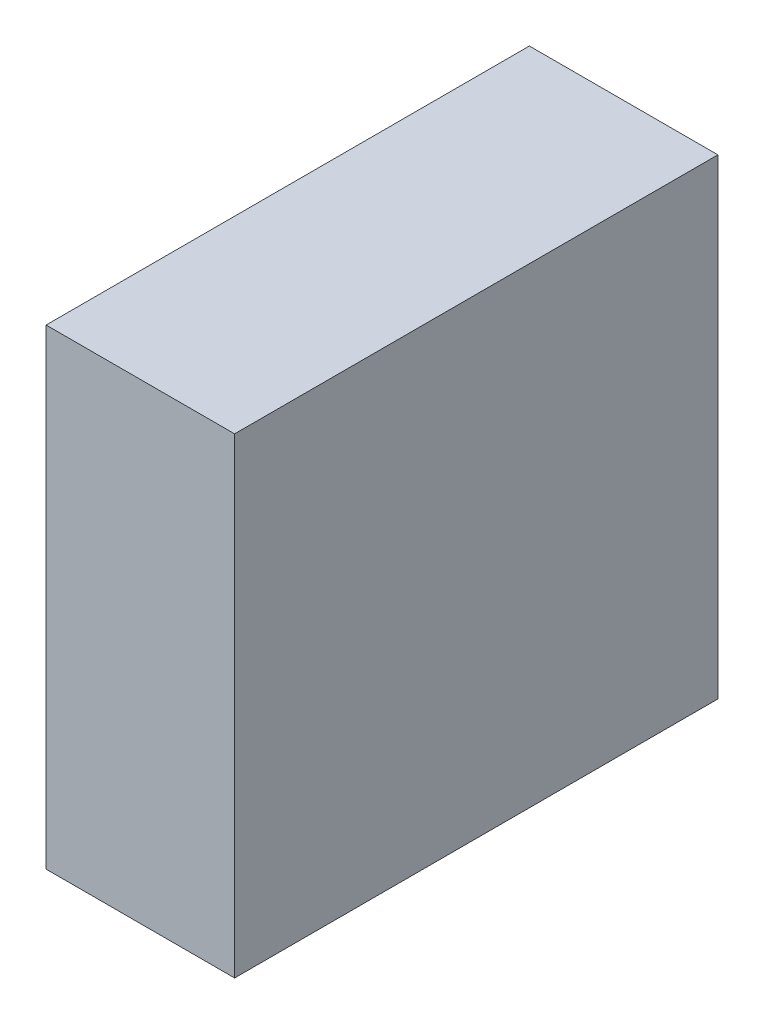
ISO-10303-21;
HEADER;
FILE_DESCRIPTION(('STEP AP214'),'2;1');
FILE_NAME('part.step','',(''),(''),'','','');
FILE_SCHEMA(('AUTOMOTIVE_DESIGN { 1 0 10303 214 1 1 1 1 }'));
ENDSEC;
DATA;
#1=APPLICATION_CONTEXT('core data for automotive mechanical design processes');
#2=APPLICATION_PROTOCOL_DEFINITION('international standard','automotive_design',2000,#1);
#3=PRODUCT_CONTEXT('',#1,'mechanical');
#4=PRODUCT('Part','Part','',(#3));
#5=PRODUCT_RELATED_PRODUCT_CATEGORY('part','',(#4));
#6=PRODUCT_DEFINITION_FORMATION('','',#4);
#7=PRODUCT_DEFINITION_CONTEXT('part definition',#1,'design');
#8=PRODUCT_DEFINITION('design','',#6,#7);
#9=PRODUCT_DEFINITION_SHAPE('','',#8);
#10=(LENGTH_UNIT() NAMED_UNIT(*) SI_UNIT(.MILLI.,.METRE.));
#11=(NAMED_UNIT(*) PLANE_ANGLE_UNIT() SI_UNIT($,.RADIAN.));
#12=(NAMED_UNIT(*) SI_UNIT($,.STERADIAN.) SOLID_ANGLE_UNIT());
#13=UNCERTAINTY_MEASURE_WITH_UNIT(LENGTH_MEASURE(1.E-05),#10,'distance_accuracy_value','');
#14=(GEOMETRIC_REPRESENTATION_CONTEXT(3) GLOBAL_UNCERTAINTY_ASSIGNED_CONTEXT((#13)) GLOBAL_UNIT_ASSIGNED_CONTEXT((#10,
#11,#12)) REPRESENTATION_CONTEXT('',''));
#15=CARTESIAN_POINT('',(0.,0.,0.));
#16=DIRECTION('',(0.,0.,1.));
#17=DIRECTION('',(1.,0.,0.));
#18=AXIS2_PLACEMENT_3D('',#15,#16,#17);
#19=CARTESIAN_POINT('',(12.7,31.75,65.119999984));
#20=DIRECTION('',(-1.,0.,0.));
#21=DIRECTION('',(0.,-1.,0.));
#22=AXIS2_PLACEMENT_3D('',#19,#20,#21);
#23=PLANE('',#22);
#24=DIRECTION('',(0.,1.,0.));
#25=VECTOR('',#24,1.);
#26=CARTESIAN_POINT('',(12.7,31.75,0.));
#27=LINE('',#26,#25);
#28=CARTESIAN_POINT('',(12.7,-31.75,0.));
#29=VERTEX_POINT('',#28);
#30=CARTESIAN_POINT('',(12.7,31.75,0.));
#31=VERTEX_POINT('',#30);
#32=EDGE_CURVE('E96',#29,#31,#27,.T.);
#33=ORIENTED_EDGE('',*,*,#32,.T.);
#34=DIRECTION('',(0.,0.,-1.));
#35=VECTOR('',#34,1.);
#36=CARTESIAN_POINT('',(12.7,31.75,65.119999984));
#37=LINE('',#36,#35);
#38=CARTESIAN_POINT('',(12.7,31.75,65.119999984));
#39=VERTEX_POINT('',#38);
#40=EDGE_CURVE('E11',#39,#31,#37,.T.);
#41=ORIENTED_EDGE('',*,*,#40,.F.);
#42=DIRECTION('',(0.,1.,0.));
#43=VECTOR('',#42,1.);
#44=CARTESIAN_POINT('',(12.7,31.75,65.119999984));
#45=LINE('',#44,#43);
#46=CARTESIAN_POINT('',(12.7,-31.75,65.119999984));
#47=VERTEX_POINT('',#46);
#48=EDGE_CURVE('E84',#47,#39,#45,.T.);
#49=ORIENTED_EDGE('',*,*,#48,.F.);
#50=DIRECTION('',(0.,0.,-1.));
#51=VECTOR('',#50,1.);
#52=CARTESIAN_POINT('',(12.7,-31.75,65.119999984));
#53=LINE('',#52,#51);
#54=EDGE_CURVE('E92',#47,#29,#53,.T.);
#55=ORIENTED_EDGE('',*,*,#54,.T.);
#56=EDGE_LOOP('',(#33,#41,#49,#55));
#57=FACE_BOUND('',#56,.T.);
#58=ADVANCED_FACE('F33',(#57),#23,.F.);
#59=CARTESIAN_POINT('',(-12.7,31.75,65.119999984));
#60=DIRECTION('',(0.,-1.,0.));
#61=DIRECTION('',(0.,0.,-1.));
#62=AXIS2_PLACEMENT_3D('',#59,#60,#61);
#63=PLANE('',#62);
#64=DIRECTION('',(-1.,0.,0.));
#65=VECTOR('',#64,1.);
#66=CARTESIAN_POINT('',(-12.7,31.75,0.));
#67=LINE('',#66,#65);
#68=CARTESIAN_POINT('',(-12.7,31.75,0.));
#69=VERTEX_POINT('',#68);
#70=EDGE_CURVE('E88',#31,#69,#67,.T.);
#71=ORIENTED_EDGE('',*,*,#70,.T.);
#72=DIRECTION('',(0.,0.,-1.));
#73=VECTOR('',#72,1.);
#74=CARTESIAN_POINT('',(-12.7,31.75,65.119999984));
#75=LINE('',#74,#73);
#76=CARTESIAN_POINT('',(-12.7,31.75,65.119999984));
#77=VERTEX_POINT('',#76);
#78=EDGE_CURVE('E41',#77,#69,#75,.T.);
#79=ORIENTED_EDGE('',*,*,#78,.F.);
#80=DIRECTION('',(-1.,0.,0.));
#81=VECTOR('',#80,1.);
#82=CARTESIAN_POINT('',(-12.7,31.75,65.119999984));
#83=LINE('',#82,#81);
#84=EDGE_CURVE('E79',#39,#77,#83,.T.);
#85=ORIENTED_EDGE('',*,*,#84,.F.);
#86=ORIENTED_EDGE('',*,*,#40,.T.);
#87=EDGE_LOOP('',(#71,#79,#85,#86));
#88=FACE_BOUND('',#87,.T.);
#89=ADVANCED_FACE('F87',(#88),#63,.F.);
#90=CARTESIAN_POINT('',(-12.7,31.75,65.119999984));
#91=DIRECTION('',(1.,0.,0.));
#92=DIRECTION('',(0.,1.,0.));
#93=AXIS2_PLACEMENT_3D('',#90,#91,#92);
#94=PLANE('',#93);
#95=DIRECTION('',(0.,-1.,0.));
#96=VECTOR('',#95,1.);
#97=CARTESIAN_POINT('',(-12.7,31.75,0.));
#98=LINE('',#97,#96);
#99=CARTESIAN_POINT('',(-12.7,-31.75,0.));
#100=VERTEX_POINT('',#99);
#101=EDGE_CURVE('E66',#69,#100,#98,.T.);
#102=ORIENTED_EDGE('',*,*,#101,.T.);
#103=DIRECTION('',(0.,0.,-1.));
#104=VECTOR('',#103,1.);
#105=CARTESIAN_POINT('',(-12.7,-31.75,65.119999984));
#106=LINE('',#105,#104);
#107=CARTESIAN_POINT('',(-12.7,-31.75,65.119999984));
#108=VERTEX_POINT('',#107);
#109=EDGE_CURVE('E89',#108,#100,#106,.T.);
#110=ORIENTED_EDGE('',*,*,#109,.F.);
#111=DIRECTION('',(0.,-1.,0.));
#112=VECTOR('',#111,1.);
#113=CARTESIAN_POINT('',(-12.7,31.75,65.119999984));
#114=LINE('',#113,#112);
#115=EDGE_CURVE('E82',#77,#108,#114,.T.);
#116=ORIENTED_EDGE('',*,*,#115,.F.);
#117=ORIENTED_EDGE('',*,*,#78,.T.);
#118=EDGE_LOOP('',(#102,#110,#116,#117));
#119=FACE_BOUND('',#118,.T.);
#120=ADVANCED_FACE('F90',(#119),#94,.F.);
#121=CARTESIAN_POINT('',(-12.7,-31.75,65.119999984));
#122=DIRECTION('',(0.,1.,0.));
#123=DIRECTION('',(0.,0.,1.));
#124=AXIS2_PLACEMENT_3D('',#121,#122,#123);
#125=PLANE('',#124);
#126=DIRECTION('',(1.,0.,0.));
#127=VECTOR('',#126,1.);
#128=CARTESIAN_POINT('',(-12.7,-31.75,0.));
#129=LINE('',#128,#127);
#130=EDGE_CURVE('E72',#100,#29,#129,.T.);
#131=ORIENTED_EDGE('',*,*,#130,.T.);
#132=ORIENTED_EDGE('',*,*,#54,.F.);
#133=DIRECTION('',(1.,0.,0.));
#134=VECTOR('',#133,1.);
#135=CARTESIAN_POINT('',(-12.7,-31.75,65.119999984));
#136=LINE('',#135,#134);
#137=EDGE_CURVE('E49',#108,#47,#136,.T.);
#138=ORIENTED_EDGE('',*,*,#137,.F.);
#139=ORIENTED_EDGE('',*,*,#109,.T.);
#140=EDGE_LOOP('',(#131,#132,#138,#139));
#141=FACE_BOUND('',#140,.T.);
#142=ADVANCED_FACE('F103',(#141),#125,.F.);
#143=CARTESIAN_POINT('',(0.,0.,65.119999984));
#144=DIRECTION('',(0.,0.,1.));
#145=DIRECTION('',(1.,0.,0.));
#146=AXIS2_PLACEMENT_3D('',#143,#144,#145);
#147=PLANE('',#146);
#148=ORIENTED_EDGE('',*,*,#48,.T.);
#149=ORIENTED_EDGE('',*,*,#84,.T.);
#150=ORIENTED_EDGE('',*,*,#115,.T.);
#151=ORIENTED_EDGE('',*,*,#137,.T.);
#152=EDGE_LOOP('',(#148,#149,#150,#151));
#153=FACE_BOUND('',#152,.T.);
#154=ADVANCED_FACE('F80',(#153),#147,.T.);
#155=CARTESIAN_POINT('',(0.,0.,0.));
#156=DIRECTION('',(0.,0.,1.));
#157=DIRECTION('',(1.,0.,0.));
#158=AXIS2_PLACEMENT_3D('',#155,#156,#157);
#159=PLANE('',#158);
#160=ORIENTED_EDGE('',*,*,#32,.F.);
#161=ORIENTED_EDGE('',*,*,#130,.F.);
#162=ORIENTED_EDGE('',*,*,#101,.F.);
#163=ORIENTED_EDGE('',*,*,#70,.F.);
#164=EDGE_LOOP('',(#160,#161,#162,#163));
#165=FACE_BOUND('',#164,.T.);
#166=ADVANCED_FACE('F106',(#165),#159,.F.);
#167=CLOSED_SHELL('',(#58,#89,#120,#142,#154,#166));
#168=MANIFOLD_SOLID_BREP('B2',#167);
#169=ADVANCED_BREP_SHAPE_REPRESENTATION('',(#18,#168),#14);
#170=SHAPE_DEFINITION_REPRESENTATION(#9,#169);
ENDSEC;
END-ISO-10303-21;
